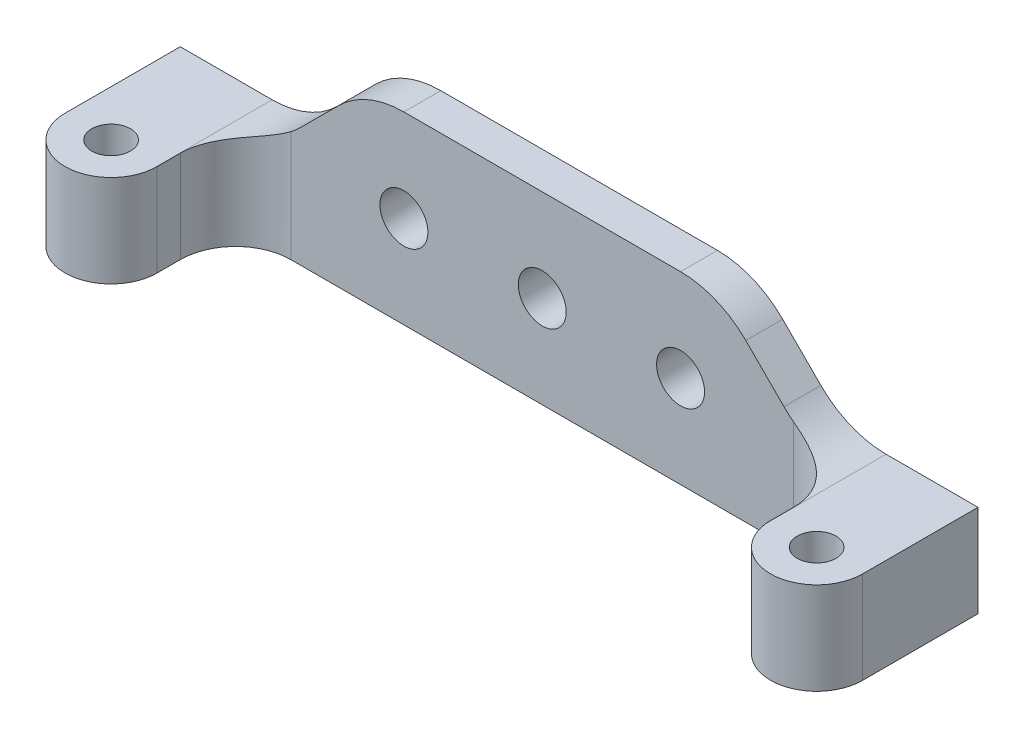
ISO-10303-21;
HEADER;
FILE_DESCRIPTION(('STEP AP214'),'2;1');
FILE_NAME('part.step','',(''),(''),'','','');
FILE_SCHEMA(('AUTOMOTIVE_DESIGN { 1 0 10303 214 1 1 1 1 }'));
ENDSEC;
DATA;
#1=APPLICATION_CONTEXT('core data for automotive mechanical design processes');
#2=APPLICATION_PROTOCOL_DEFINITION('international standard','automotive_design',2000,#1);
#3=PRODUCT_CONTEXT('',#1,'mechanical');
#4=PRODUCT('Part','Part','',(#3));
#5=PRODUCT_RELATED_PRODUCT_CATEGORY('part','',(#4));
#6=PRODUCT_DEFINITION_FORMATION('','',#4);
#7=PRODUCT_DEFINITION_CONTEXT('part definition',#1,'design');
#8=PRODUCT_DEFINITION('design','',#6,#7);
#9=PRODUCT_DEFINITION_SHAPE('','',#8);
#10=(LENGTH_UNIT() NAMED_UNIT(*) SI_UNIT(.MILLI.,.METRE.));
#11=(NAMED_UNIT(*) PLANE_ANGLE_UNIT() SI_UNIT($,.RADIAN.));
#12=(NAMED_UNIT(*) SI_UNIT($,.STERADIAN.) SOLID_ANGLE_UNIT());
#13=UNCERTAINTY_MEASURE_WITH_UNIT(LENGTH_MEASURE(1.E-05),#10,'distance_accuracy_value','');
#14=(GEOMETRIC_REPRESENTATION_CONTEXT(3) GLOBAL_UNCERTAINTY_ASSIGNED_CONTEXT((#13)) GLOBAL_UNIT_ASSIGNED_CONTEXT((#10,
#11,#12)) REPRESENTATION_CONTEXT('',''));
#15=CARTESIAN_POINT('',(0.,0.,0.));
#16=DIRECTION('',(0.,0.,1.));
#17=DIRECTION('',(1.,0.,0.));
#18=AXIS2_PLACEMENT_3D('',#15,#16,#17);
#19=CARTESIAN_POINT('',(-50.9999999999999,10.,17.5000000000001));
#20=DIRECTION('',(0.,0.,-1.));
#21=DIRECTION('',(-1.,0.,0.));
#22=AXIS2_PLACEMENT_3D('',#19,#20,#21);
#23=CYLINDRICAL_SURFACE('',#22,2.6);
#24=CARTESIAN_POINT('',(-50.9999999999999,10.,0.));
#25=DIRECTION('',(0.,0.,1.));
#26=DIRECTION('',(1.,0.,0.));
#27=AXIS2_PLACEMENT_3D('',#24,#25,#26);
#28=CIRCLE('',#27,2.6);
#29=CARTESIAN_POINT('',(-48.3999999999999,10.,0.));
#30=VERTEX_POINT('',#29);
#31=EDGE_CURVE('E406',#30,#30,#28,.T.);
#32=ORIENTED_EDGE('',*,*,#31,.F.);
#33=EDGE_LOOP('',(#32));
#34=FACE_BOUND('',#33,.T.);
#35=CARTESIAN_POINT('',(-50.9999999999999,10.,4.00000000000001));
#36=DIRECTION('',(0.,0.,-1.));
#37=DIRECTION('',(-1.,0.,0.));
#38=AXIS2_PLACEMENT_3D('',#35,#36,#37);
#39=CIRCLE('',#38,2.6);
#40=CARTESIAN_POINT('',(-53.5999999999999,10.,4.00000000000001));
#41=VERTEX_POINT('',#40);
#42=EDGE_CURVE('E384',#41,#41,#39,.F.);
#43=ORIENTED_EDGE('',*,*,#42,.T.);
#44=EDGE_LOOP('',(#43));
#45=FACE_BOUND('',#44,.T.);
#46=ADVANCED_FACE('F43',(#34,#45),#23,.F.);
#47=CARTESIAN_POINT('',(-35.9999999999999,10.,17.5000000000001));
#48=DIRECTION('',(0.,0.,-1.));
#49=DIRECTION('',(-1.,0.,0.));
#50=AXIS2_PLACEMENT_3D('',#47,#48,#49);
#51=CYLINDRICAL_SURFACE('',#50,2.6);
#52=CARTESIAN_POINT('',(-35.9999999999999,10.,0.));
#53=DIRECTION('',(0.,0.,1.));
#54=DIRECTION('',(1.,0.,0.));
#55=AXIS2_PLACEMENT_3D('',#52,#53,#54);
#56=CIRCLE('',#55,2.6);
#57=CARTESIAN_POINT('',(-33.3999999999999,10.,0.));
#58=VERTEX_POINT('',#57);
#59=EDGE_CURVE('E389',#58,#58,#56,.T.);
#60=ORIENTED_EDGE('',*,*,#59,.F.);
#61=EDGE_LOOP('',(#60));
#62=FACE_BOUND('',#61,.T.);
#63=CARTESIAN_POINT('',(-35.9999999999999,10.,4.00000000000001));
#64=DIRECTION('',(0.,0.,-1.));
#65=DIRECTION('',(-1.,0.,0.));
#66=AXIS2_PLACEMENT_3D('',#63,#64,#65);
#67=CIRCLE('',#66,2.6);
#68=CARTESIAN_POINT('',(-38.5999999999999,10.,4.00000000000001));
#69=VERTEX_POINT('',#68);
#70=EDGE_CURVE('E47',#69,#69,#67,.F.);
#71=ORIENTED_EDGE('',*,*,#70,.T.);
#72=EDGE_LOOP('',(#71));
#73=FACE_BOUND('',#72,.T.);
#74=ADVANCED_FACE('F282',(#62,#73),#51,.F.);
#75=CARTESIAN_POINT('',(0.,10.,17.5000000000001));
#76=DIRECTION('',(0.,-1.,0.));
#77=DIRECTION('',(0.,0.,-1.));
#78=AXIS2_PLACEMENT_3D('',#75,#76,#77);
#79=PLANE('',#78);
#80=CARTESIAN_POINT('',(-12.7500000000001,10.,12.5000000000001));
#81=DIRECTION('',(0.,-1.,0.));
#82=DIRECTION('',(0.,0.,-1.));
#83=AXIS2_PLACEMENT_3D('',#80,#81,#82);
#84=CIRCLE('',#83,5.);
#85=CARTESIAN_POINT('',(-7.74999999999993,10.,12.5000000000001));
#86=VERTEX_POINT('',#85);
#87=CARTESIAN_POINT('',(-17.715728752538,10.,13.0844124880761));
#88=VERTEX_POINT('',#87);
#89=EDGE_CURVE('E295',#86,#88,#84,.T.);
#90=ORIENTED_EDGE('',*,*,#89,.F.);
#91=DIRECTION('',(0.,0.,-1.));
#92=VECTOR('',#91,1.);
#93=CARTESIAN_POINT('',(-7.74999999999993,10.,17.5000000000001));
#94=LINE('',#93,#92);
#95=CARTESIAN_POINT('',(-7.74999999999993,10.,0.));
#96=VERTEX_POINT('',#95);
#97=EDGE_CURVE('E356',#86,#96,#94,.T.);
#98=ORIENTED_EDGE('',*,*,#97,.T.);
#99=DIRECTION('',(-1.,0.,0.));
#100=VECTOR('',#99,1.);
#101=CARTESIAN_POINT('',(0.,10.,0.));
#102=LINE('',#101,#100);
#103=CARTESIAN_POINT('',(-17.715728752538,10.,0.));
#104=VERTEX_POINT('',#103);
#105=EDGE_CURVE('E363',#96,#104,#102,.T.);
#106=ORIENTED_EDGE('',*,*,#105,.T.);
#107=DIRECTION('',(0.,0.,-1.));
#108=VECTOR('',#107,1.);
#109=CARTESIAN_POINT('',(-17.715728752538,10.,17.5000000000001));
#110=LINE('',#109,#108);
#111=EDGE_CURVE('E424',#88,#104,#110,.T.);
#112=ORIENTED_EDGE('',*,*,#111,.F.);
#113=EDGE_LOOP('',(#90,#98,#106,#112));
#114=FACE_BOUND('',#113,.T.);
#115=CARTESIAN_POINT('',(-12.7500000000001,10.,12.5000000000001));
#116=DIRECTION('',(0.,-1.,0.));
#117=DIRECTION('',(0.,0.,-1.));
#118=AXIS2_PLACEMENT_3D('',#115,#116,#117);
#119=CIRCLE('',#118,2.10000000000022);
#120=CARTESIAN_POINT('',(-12.7500000000001,10.,10.3999999999999));
#121=VERTEX_POINT('',#120);
#122=EDGE_CURVE('E250',#121,#121,#119,.T.);
#123=ORIENTED_EDGE('',*,*,#122,.T.);
#124=EDGE_LOOP('',(#123));
#125=FACE_BOUND('',#124,.T.);
#126=ADVANCED_FACE('F278',(#114,#125),#79,.F.);
#127=CARTESIAN_POINT('',(-17.715728752538,20.,17.5000000000001));
#128=DIRECTION('',(0.,0.,-1.));
#129=DIRECTION('',(-1.,0.,0.));
#130=AXIS2_PLACEMENT_3D('',#127,#128,#129);
#131=CYLINDRICAL_SURFACE('',#130,10.);
#132=CARTESIAN_POINT('',(-17.715728752538,10.,13.0844124880761));
#133=CARTESIAN_POINT('',(-17.72714759944,10.0000122219756,12.98734507658));
#134=CARTESIAN_POINT('',(-17.7357129601795,10.0000232268045,12.8901103301895));
#135=CARTESIAN_POINT('',(-17.7471367093408,10.0000428021687,12.6953061674979));
#136=CARTESIAN_POINT('',(-17.7499950977553,10.000051372704,12.5977367511963));
#137=CARTESIAN_POINT('',(-17.7500000000002,10.0000587260926,12.5000000000001));
#138=B_SPLINE_CURVE_WITH_KNOTS('',3,(#132,#133,#134,#135,#136,#137),.UNSPECIFIED.,.F.,.F.,(4,2,
4),(0.,0.292833831518646,0.585667663404383),.UNSPECIFIED.);
#139=CARTESIAN_POINT('',(-17.7499999999999,10.0000587260926,12.5000000000001));
#140=VERTEX_POINT('',#139);
#141=EDGE_CURVE('E285',#88,#140,#138,.T.);
#142=ORIENTED_EDGE('',*,*,#141,.F.);
#143=ORIENTED_EDGE('',*,*,#111,.T.);
#144=CARTESIAN_POINT('',(-17.715728752538,20.,0.));
#145=DIRECTION('',(0.,0.,1.));
#146=DIRECTION('',(1.,0.,0.));
#147=AXIS2_PLACEMENT_3D('',#144,#145,#146);
#148=CIRCLE('',#147,10.);
#149=CARTESIAN_POINT('',(-24.7867965644034,12.9289321881345,0.));
#150=VERTEX_POINT('',#149);
#151=EDGE_CURVE('E381',#104,#150,#148,.F.);
#152=ORIENTED_EDGE('',*,*,#151,.T.);
#153=DIRECTION('',(0.,0.,-1.));
#154=VECTOR('',#153,1.);
#155=CARTESIAN_POINT('',(-24.7867965644034,12.9289321881345,17.5000000000001));
#156=LINE('',#155,#154);
#157=CARTESIAN_POINT('',(-24.7867965644034,12.9289321881345,4.));
#158=VERTEX_POINT('',#157);
#159=EDGE_CURVE('E52',#158,#150,#156,.T.);
#160=ORIENTED_EDGE('',*,*,#159,.F.);
#161=CARTESIAN_POINT('',(-17.715728752538,20.,4.));
#162=DIRECTION('',(0.,0.,-1.));
#163=DIRECTION('',(-1.,0.,0.));
#164=AXIS2_PLACEMENT_3D('',#161,#162,#163);
#165=CIRCLE('',#164,10.);
#166=CARTESIAN_POINT('',(-23.7499999999999,12.0258185051973,4.));
#167=VERTEX_POINT('',#166);
#168=EDGE_CURVE('E245',#167,#158,#165,.T.);
#169=ORIENTED_EDGE('',*,*,#168,.F.);
#170=CARTESIAN_POINT('',(-23.7499999999999,12.0258185051973,4.));
#171=CARTESIAN_POINT('',(-23.6172230581114,11.92530824979,3.99998646530528));
#172=CARTESIAN_POINT('',(-23.481858145601,11.8281240874138,4.00440806677916));
#173=CARTESIAN_POINT('',(-23.206815270327,11.6408417731282,4.02305046853741));
#174=CARTESIAN_POINT('',(-23.0671339219318,11.5507493908154,4.03727915752995));
#175=CARTESIAN_POINT('',(-22.7841779795801,11.3780281956086,4.07651759240204));
#176=CARTESIAN_POINT('',(-22.6408951358117,11.2954189877547,4.10155472003588));
#177=CARTESIAN_POINT('',(-22.3523846984196,11.1383761359853,4.16318413999597));
#178=CARTESIAN_POINT('',(-22.207157653609,11.063940237298,4.19977323463076));
#179=CARTESIAN_POINT('',(-21.9153865061705,10.9231473519918,4.28533238167121));
#180=CARTESIAN_POINT('',(-21.7688395201546,10.8568359435723,4.33436792943259));
#181=CARTESIAN_POINT('',(-21.4768279258171,10.732891842249,4.44508598227433));
#182=CARTESIAN_POINT('',(-21.3313634179188,10.6752599452464,4.50676964594914));
#183=CARTESIAN_POINT('',(-21.0435679339575,10.5687231259943,4.64271555176517));
#184=CARTESIAN_POINT('',(-20.9012308266656,10.5197994818704,4.71695012347833));
#185=CARTESIAN_POINT('',(-20.6210871136743,10.4302288866549,4.87789167518328));
#186=CARTESIAN_POINT('',(-20.483280122827,10.3895812304096,4.96459759148193));
#187=CARTESIAN_POINT('',(-20.2249006727214,10.3190652446057,5.14240636218474));
#188=CARTESIAN_POINT('',(-20.1038422023031,10.2885858622608,5.23256355875477));
#189=CARTESIAN_POINT('',(-19.8680326450113,10.2336162549194,5.42252704162606));
#190=CARTESIAN_POINT('',(-19.7532837822739,10.2091281314811,5.52233669664732));
#191=CARTESIAN_POINT('',(-19.5311485129902,10.1655161960305,5.73098122989024));
#192=CARTESIAN_POINT('',(-19.4237645387354,10.1463941498077,5.83981906374329));
#193=CARTESIAN_POINT('',(-19.217260689315,10.1128187575031,6.06582697833074));
#194=CARTESIAN_POINT('',(-19.1181446027684,10.0983675431257,6.18300083383213));
#195=CARTESIAN_POINT('',(-18.9277393051718,10.0732493581614,6.42648543764984));
#196=CARTESIAN_POINT('',(-18.8365728436858,10.0626357200095,6.55289762185442));
#197=CARTESIAN_POINT('',(-18.6642588809624,10.0447100995114,6.81259909595371));
#198=CARTESIAN_POINT('',(-18.5831118099201,10.0373982588963,6.94588868079007));
#199=CARTESIAN_POINT('',(-18.4313778680721,10.025349945967,7.218524520071));
#200=CARTESIAN_POINT('',(-18.3607950261754,10.0206144543973,7.35787305922247));
#201=CARTESIAN_POINT('',(-18.2307136212895,10.0130568558053,7.64164532283018));
#202=CARTESIAN_POINT('',(-18.1712119011291,10.010234203181,7.78606758772689));
#203=CARTESIAN_POINT('',(-18.0568678004271,10.0056360423449,8.09759939782555));
#204=CARTESIAN_POINT('',(-18.003555908073,10.0040371759943,8.26527555541809));
#205=CARTESIAN_POINT('',(-17.9118494109621,10.0018188181985,8.60468193996743));
#206=CARTESIAN_POINT('',(-17.8734567863854,10.0011994567258,8.77641270187065));
#207=CARTESIAN_POINT('',(-17.8118662100944,10.0004117971798,9.12277619380291));
#208=CARTESIAN_POINT('',(-17.7886851582339,10.000244000149,9.29741193119384));
#209=CARTESIAN_POINT('',(-17.7577417549573,10.0000864509712,9.6480310772821));
#210=CARTESIAN_POINT('',(-17.749978296703,10.0000966860425,9.8240143883257));
#211=CARTESIAN_POINT('',(-17.7499999999999,10.0000587260926,10.));
#212=B_SPLINE_CURVE_WITH_KNOTS('',3,(#170,#171,#172,#173,#174,#175,#176,#177,#178,#179,#180,
#181,#182,#183,#184,#185,#186,#187,#188,#189,#190,#191,#192,#193,#194,#195,#196,#197,#198,#199,
#200,#201,#202,#203,#204,#205,#206,#207,#208,#209,#210,#211),.UNSPECIFIED.,.F.,.F.,(4,2,2,2,2,2,
2,2,2,2,2,2,2,2,2,2,2,2,2,2,4),(0.,0.499560454354816,0.999523219068908,1.50076007558072,
2.00185830655493,2.50565014072847,3.00948814394277,3.5122295065983,4.01492801535128,
4.47634861589501,4.93793083797473,5.39966477308059,5.86160914073404,6.32974674191946,
6.79790443619431,7.26624022059105,7.73444236455432,8.26160848282372,8.78884454605476,
9.31666537423279,9.84444830847116),.UNSPECIFIED.);
#213=CARTESIAN_POINT('',(-17.7499999999999,10.0000587260926,10.));
#214=VERTEX_POINT('',#213);
#215=EDGE_CURVE('E408',#167,#214,#212,.T.);
#216=ORIENTED_EDGE('',*,*,#215,.T.);
#217=DIRECTION('',(0.,0.,-1.));
#218=VECTOR('',#217,1.);
#219=CARTESIAN_POINT('',(-17.7499999999999,10.0000587260926,17.5000000000001));
#220=LINE('',#219,#218);
#221=EDGE_CURVE('E294',#214,#140,#220,.F.);
#222=ORIENTED_EDGE('',*,*,#221,.T.);
#223=EDGE_LOOP('',(#142,#143,#152,#160,#169,#216,#222));
#224=FACE_BOUND('',#223,.T.);
#225=ADVANCED_FACE('F272',(#224),#131,.F.);
#226=CARTESIAN_POINT('',(-35.9999999999999,10.,17.5000000000001));
#227=DIRECTION('',(0.,0.,-1.));
#228=DIRECTION('',(-1.,0.,0.));
#229=AXIS2_PLACEMENT_3D('',#226,#227,#228);
#230=CYLINDRICAL_SURFACE('',#229,10.);
#231=DIRECTION('',(0.,0.,-1.));
#232=VECTOR('',#231,1.);
#233=CARTESIAN_POINT('',(-35.9999999999999,20.,17.5000000000001));
#234=LINE('',#233,#232);
#235=CARTESIAN_POINT('',(-35.9999999999999,20.,4.));
#236=VERTEX_POINT('',#235);
#237=CARTESIAN_POINT('',(-35.9999999999999,20.,0.));
#238=VERTEX_POINT('',#237);
#239=EDGE_CURVE('E415',#236,#238,#234,.T.);
#240=ORIENTED_EDGE('',*,*,#239,.F.);
#241=CARTESIAN_POINT('',(-35.9999999999999,10.,4.00000000000001));
#242=DIRECTION('',(0.,0.,-1.));
#243=DIRECTION('',(-1.,0.,0.));
#244=AXIS2_PLACEMENT_3D('',#241,#242,#243);
#245=CIRCLE('',#244,10.);
#246=CARTESIAN_POINT('',(-28.9289321881345,17.0710678118655,4.00000000000001));
#247=VERTEX_POINT('',#246);
#248=EDGE_CURVE('E251',#236,#247,#245,.T.);
#249=ORIENTED_EDGE('',*,*,#248,.T.);
#250=DIRECTION('',(0.,0.,-1.));
#251=VECTOR('',#250,1.);
#252=CARTESIAN_POINT('',(-28.9289321881345,17.0710678118655,17.5000000000001));
#253=LINE('',#252,#251);
#254=CARTESIAN_POINT('',(-28.9289321881345,17.0710678118655,0.));
#255=VERTEX_POINT('',#254);
#256=EDGE_CURVE('E11',#247,#255,#253,.T.);
#257=ORIENTED_EDGE('',*,*,#256,.T.);
#258=CARTESIAN_POINT('',(-35.9999999999999,10.,0.));
#259=DIRECTION('',(0.,0.,1.));
#260=DIRECTION('',(1.,0.,0.));
#261=AXIS2_PLACEMENT_3D('',#258,#259,#260);
#262=CIRCLE('',#261,10.);
#263=EDGE_CURVE('E390',#238,#255,#262,.F.);
#264=ORIENTED_EDGE('',*,*,#263,.F.);
#265=EDGE_LOOP('',(#240,#249,#257,#264));
#266=FACE_BOUND('',#265,.T.);
#267=ADVANCED_FACE('F277',(#266),#230,.T.);
#268=CARTESIAN_POINT('',(-5.92893218813432,-5.92893218813439,17.5000000000001));
#269=DIRECTION('',(0.707106781186543,0.707106781186552,0.));
#270=DIRECTION('',(-0.707106781186552,0.707106781186543,0.));
#271=AXIS2_PLACEMENT_3D('',#268,#269,#270);
#272=PLANE('',#271);
#273=ORIENTED_EDGE('',*,*,#256,.F.);
#274=DIRECTION('',(0.707106781186552,-0.707106781186543,0.));
#275=VECTOR('',#274,1.);
#276=CARTESIAN_POINT('',(-15.9289321881343,4.0710678118655,4.));
#277=LINE('',#276,#275);
#278=EDGE_CURVE('E249',#247,#158,#277,.T.);
#279=ORIENTED_EDGE('',*,*,#278,.T.);
#280=ORIENTED_EDGE('',*,*,#159,.T.);
#281=DIRECTION('',(0.707106781186552,-0.707106781186543,0.));
#282=VECTOR('',#281,1.);
#283=CARTESIAN_POINT('',(-5.92893218813432,-5.92893218813439,0.));
#284=LINE('',#283,#282);
#285=EDGE_CURVE('E386',#255,#150,#284,.T.);
#286=ORIENTED_EDGE('',*,*,#285,.F.);
#287=EDGE_LOOP('',(#273,#279,#280,#286));
#288=FACE_BOUND('',#287,.T.);
#289=ADVANCED_FACE('F303',(#288),#272,.T.);
#290=CARTESIAN_POINT('',(-12.7500000000001,20.,12.5000000000001));
#291=DIRECTION('',(0.,-1.,0.));
#292=DIRECTION('',(0.,0.,-1.));
#293=AXIS2_PLACEMENT_3D('',#290,#291,#292);
#294=CYLINDRICAL_SURFACE('',#293,5.);
#295=DIRECTION('',(0.,-1.,0.));
#296=VECTOR('',#295,1.);
#297=CARTESIAN_POINT('',(-7.74999999999993,20.,12.5000000000001));
#298=LINE('',#297,#296);
#299=CARTESIAN_POINT('',(-7.74999999999993,0.,12.5000000000001));
#300=VERTEX_POINT('',#299);
#301=EDGE_CURVE('E359',#86,#300,#298,.T.);
#302=ORIENTED_EDGE('',*,*,#301,.F.);
#303=ORIENTED_EDGE('',*,*,#89,.T.);
#304=ORIENTED_EDGE('',*,*,#141,.T.);
#305=DIRECTION('',(0.,-1.,0.));
#306=VECTOR('',#305,1.);
#307=CARTESIAN_POINT('',(-17.7499999999999,20.,12.5000000000001));
#308=LINE('',#307,#306);
#309=CARTESIAN_POINT('',(-17.7499999999999,0.,12.5000000000001));
#310=VERTEX_POINT('',#309);
#311=EDGE_CURVE('E370',#140,#310,#308,.T.);
#312=ORIENTED_EDGE('',*,*,#311,.T.);
#313=CARTESIAN_POINT('',(-12.7500000000001,0.,12.5000000000001));
#314=DIRECTION('',(0.,1.,0.));
#315=DIRECTION('',(0.,0.,1.));
#316=AXIS2_PLACEMENT_3D('',#313,#314,#315);
#317=CIRCLE('',#316,5.);
#318=EDGE_CURVE('E368',#310,#300,#317,.T.);
#319=ORIENTED_EDGE('',*,*,#318,.T.);
#320=EDGE_LOOP('',(#302,#303,#304,#312,#319));
#321=FACE_BOUND('',#320,.T.);
#322=ADVANCED_FACE('F298',(#321),#294,.T.);
#323=CARTESIAN_POINT('',(-12.7500000000001,20.,12.5000000000001));
#324=DIRECTION('',(0.,-1.,0.));
#325=DIRECTION('',(0.,0.,-1.));
#326=AXIS2_PLACEMENT_3D('',#323,#324,#325);
#327=CYLINDRICAL_SURFACE('',#326,2.10000000000022);
#328=CARTESIAN_POINT('',(-12.7500000000001,0.,12.5000000000001));
#329=DIRECTION('',(0.,1.,0.));
#330=DIRECTION('',(0.,0.,1.));
#331=AXIS2_PLACEMENT_3D('',#328,#329,#330);
#332=CIRCLE('',#331,2.10000000000022);
#333=CARTESIAN_POINT('',(-12.7500000000001,0.,14.6000000000003));
#334=VERTEX_POINT('',#333);
#335=EDGE_CURVE('E398',#334,#334,#332,.T.);
#336=ORIENTED_EDGE('',*,*,#335,.F.);
#337=EDGE_LOOP('',(#336));
#338=FACE_BOUND('',#337,.T.);
#339=ORIENTED_EDGE('',*,*,#122,.F.);
#340=EDGE_LOOP('',(#339));
#341=FACE_BOUND('',#340,.T.);
#342=ADVANCED_FACE('F302',(#338,#341),#327,.F.);
#343=CARTESIAN_POINT('',(-23.7499999999999,20.,10.));
#344=DIRECTION('',(0.,-1.,0.));
#345=DIRECTION('',(0.,0.,-1.));
#346=AXIS2_PLACEMENT_3D('',#343,#344,#345);
#347=CYLINDRICAL_SURFACE('',#346,6.);
#348=ORIENTED_EDGE('',*,*,#215,.F.);
#349=DIRECTION('',(0.,-1.,0.));
#350=VECTOR('',#349,1.);
#351=CARTESIAN_POINT('',(-23.7499999999999,20.,4.));
#352=LINE('',#351,#350);
#353=CARTESIAN_POINT('',(-23.7499999999999,0.,4.));
#354=VERTEX_POINT('',#353);
#355=EDGE_CURVE('E372',#167,#354,#352,.T.);
#356=ORIENTED_EDGE('',*,*,#355,.T.);
#357=CARTESIAN_POINT('',(-23.7499999999999,0.,10.));
#358=DIRECTION('',(0.,1.,0.));
#359=DIRECTION('',(0.,0.,1.));
#360=AXIS2_PLACEMENT_3D('',#357,#358,#359);
#361=CIRCLE('',#360,6.);
#362=CARTESIAN_POINT('',(-17.7499999999999,0.,10.));
#363=VERTEX_POINT('',#362);
#364=EDGE_CURVE('E60',#363,#354,#361,.T.);
#365=ORIENTED_EDGE('',*,*,#364,.F.);
#366=DIRECTION('',(0.,-1.,0.));
#367=VECTOR('',#366,1.);
#368=CARTESIAN_POINT('',(-17.7499999999999,20.,10.));
#369=LINE('',#368,#367);
#370=EDGE_CURVE('E374',#214,#363,#369,.T.);
#371=ORIENTED_EDGE('',*,*,#370,.F.);
#372=EDGE_LOOP('',(#348,#356,#365,#371));
#373=FACE_BOUND('',#372,.T.);
#374=ADVANCED_FACE('F268',(#373),#347,.F.);
#375=CARTESIAN_POINT('',(0.,20.,4.));
#376=DIRECTION('',(0.,0.,-1.));
#377=DIRECTION('',(-1.,0.,0.));
#378=AXIS2_PLACEMENT_3D('',#375,#376,#377);
#379=PLANE('',#378);
#380=ORIENTED_EDGE('',*,*,#42,.F.);
#381=EDGE_LOOP('',(#380));
#382=FACE_BOUND('',#381,.T.);
#383=DIRECTION('',(1.,0.,0.));
#384=VECTOR('',#383,1.);
#385=CARTESIAN_POINT('',(0.,20.,4.));
#386=LINE('',#385,#384);
#387=CARTESIAN_POINT('',(-65.9999999999999,20.,4.));
#388=VERTEX_POINT('',#387);
#389=EDGE_CURVE('E399',#388,#236,#386,.T.);
#390=ORIENTED_EDGE('',*,*,#389,.F.);
#391=CARTESIAN_POINT('',(-65.9999999999999,10.,4.00000000000001));
#392=DIRECTION('',(0.,0.,1.));
#393=DIRECTION('',(1.,0.,0.));
#394=AXIS2_PLACEMENT_3D('',#391,#392,#393);
#395=CIRCLE('',#394,10.);
#396=CARTESIAN_POINT('',(-73.0710678118653,17.0710678118655,4.00000000000001));
#397=VERTEX_POINT('',#396);
#398=EDGE_CURVE('E211',#388,#397,#395,.T.);
#399=ORIENTED_EDGE('',*,*,#398,.T.);
#400=DIRECTION('',(-0.707106781186552,-0.707106781186543,0.));
#401=VECTOR('',#400,1.);
#402=CARTESIAN_POINT('',(-86.0710678118655,4.0710678118655,4.));
#403=LINE('',#402,#401);
#404=CARTESIAN_POINT('',(-77.2132034355964,12.9289321881345,4.));
#405=VERTEX_POINT('',#404);
#406=EDGE_CURVE('E244',#397,#405,#403,.T.);
#407=ORIENTED_EDGE('',*,*,#406,.T.);
#408=CARTESIAN_POINT('',(-84.2842712474619,20.,4.));
#409=DIRECTION('',(0.,0.,1.));
#410=DIRECTION('',(1.,0.,0.));
#411=AXIS2_PLACEMENT_3D('',#408,#409,#410);
#412=CIRCLE('',#411,10.);
#413=CARTESIAN_POINT('',(-78.2499999999999,12.0258185051973,4.));
#414=VERTEX_POINT('',#413);
#415=EDGE_CURVE('E206',#414,#405,#412,.T.);
#416=ORIENTED_EDGE('',*,*,#415,.F.);
#417=DIRECTION('',(0.,-1.,0.));
#418=VECTOR('',#417,1.);
#419=CARTESIAN_POINT('',(-78.2499999999999,20.,4.));
#420=LINE('',#419,#418);
#421=CARTESIAN_POINT('',(-78.2499999999999,0.,4.));
#422=VERTEX_POINT('',#421);
#423=EDGE_CURVE('E199',#414,#422,#420,.T.);
#424=ORIENTED_EDGE('',*,*,#423,.T.);
#425=DIRECTION('',(1.,0.,0.));
#426=VECTOR('',#425,1.);
#427=CARTESIAN_POINT('',(0.,0.,4.));
#428=LINE('',#427,#426);
#429=EDGE_CURVE('E380',#422,#354,#428,.T.);
#430=ORIENTED_EDGE('',*,*,#429,.T.);
#431=ORIENTED_EDGE('',*,*,#355,.F.);
#432=ORIENTED_EDGE('',*,*,#168,.T.);
#433=ORIENTED_EDGE('',*,*,#278,.F.);
#434=ORIENTED_EDGE('',*,*,#248,.F.);
#435=EDGE_LOOP('',(#390,#399,#407,#416,#424,#430,#431,#432,#433,#434));
#436=FACE_BOUND('',#435,.T.);
#437=ORIENTED_EDGE('',*,*,#70,.F.);
#438=EDGE_LOOP('',(#437));
#439=FACE_BOUND('',#438,.T.);
#440=CARTESIAN_POINT('',(-65.9999999999999,10.,4.00000000000001));
#441=DIRECTION('',(0.,0.,1.));
#442=DIRECTION('',(1.,0.,0.));
#443=AXIS2_PLACEMENT_3D('',#440,#441,#442);
#444=CIRCLE('',#443,2.6);
#445=CARTESIAN_POINT('',(-63.3999999999999,10.,4.00000000000001));
#446=VERTEX_POINT('',#445);
#447=EDGE_CURVE('E241',#446,#446,#444,.F.);
#448=ORIENTED_EDGE('',*,*,#447,.T.);
#449=EDGE_LOOP('',(#448));
#450=FACE_BOUND('',#449,.T.);
#451=ADVANCED_FACE('F45',(#382,#436,#439,#450),#379,.F.);
#452=CARTESIAN_POINT('',(-17.7499999999999,20.,0.));
#453=DIRECTION('',(-1.,0.,0.));
#454=DIRECTION('',(0.,0.,1.));
#455=AXIS2_PLACEMENT_3D('',#452,#453,#454);
#456=PLANE('',#455);
#457=ORIENTED_EDGE('',*,*,#221,.F.);
#458=ORIENTED_EDGE('',*,*,#370,.T.);
#459=DIRECTION('',(0.,0.,-1.));
#460=VECTOR('',#459,1.);
#461=CARTESIAN_POINT('',(-17.7499999999999,0.,0.));
#462=LINE('',#461,#460);
#463=EDGE_CURVE('E67',#310,#363,#462,.T.);
#464=ORIENTED_EDGE('',*,*,#463,.F.);
#465=ORIENTED_EDGE('',*,*,#311,.F.);
#466=EDGE_LOOP('',(#457,#458,#464,#465));
#467=FACE_BOUND('',#466,.T.);
#468=ADVANCED_FACE('F280',(#467),#456,.T.);
#469=CARTESIAN_POINT('',(0.,0.,0.));
#470=DIRECTION('',(0.,1.,0.));
#471=DIRECTION('',(0.,0.,1.));
#472=AXIS2_PLACEMENT_3D('',#469,#470,#471);
#473=PLANE('',#472);
#474=ORIENTED_EDGE('',*,*,#364,.T.);
#475=ORIENTED_EDGE('',*,*,#429,.F.);
#476=CARTESIAN_POINT('',(-78.2499999999999,0.,10.));
#477=DIRECTION('',(0.,-1.,0.));
#478=DIRECTION('',(0.,0.,1.));
#479=AXIS2_PLACEMENT_3D('',#476,#477,#478);
#480=CIRCLE('',#479,6.);
#481=CARTESIAN_POINT('',(-84.2499999999999,0.,10.));
#482=VERTEX_POINT('',#481);
#483=EDGE_CURVE('E664',#482,#422,#480,.T.);
#484=ORIENTED_EDGE('',*,*,#483,.F.);
#485=DIRECTION('',(0.,0.,-1.));
#486=VECTOR('',#485,1.);
#487=CARTESIAN_POINT('',(-84.2499999999999,0.,0.));
#488=LINE('',#487,#486);
#489=CARTESIAN_POINT('',(-84.2499999999999,0.,12.5000000000001));
#490=VERTEX_POINT('',#489);
#491=EDGE_CURVE('E181',#490,#482,#488,.T.);
#492=ORIENTED_EDGE('',*,*,#491,.F.);
#493=CARTESIAN_POINT('',(-89.2499999999997,0.,12.5000000000001));
#494=DIRECTION('',(0.,-1.,0.));
#495=DIRECTION('',(0.,0.,1.));
#496=AXIS2_PLACEMENT_3D('',#493,#494,#495);
#497=CIRCLE('',#496,5.);
#498=CARTESIAN_POINT('',(-94.2499999999999,0.,12.5000000000001));
#499=VERTEX_POINT('',#498);
#500=EDGE_CURVE('E185',#490,#499,#497,.T.);
#501=ORIENTED_EDGE('',*,*,#500,.T.);
#502=DIRECTION('',(0.,0.,-1.));
#503=VECTOR('',#502,1.);
#504=CARTESIAN_POINT('',(-94.2499999999999,0.,0.));
#505=LINE('',#504,#503);
#506=CARTESIAN_POINT('',(-94.2499999999999,0.,0.));
#507=VERTEX_POINT('',#506);
#508=EDGE_CURVE('E171',#499,#507,#505,.T.);
#509=ORIENTED_EDGE('',*,*,#508,.T.);
#510=DIRECTION('',(-1.,0.,0.));
#511=VECTOR('',#510,1.);
#512=CARTESIAN_POINT('',(0.,0.,0.));
#513=LINE('',#512,#511);
#514=CARTESIAN_POINT('',(-7.74999999999993,0.,0.));
#515=VERTEX_POINT('',#514);
#516=EDGE_CURVE('E403',#515,#507,#513,.T.);
#517=ORIENTED_EDGE('',*,*,#516,.F.);
#518=DIRECTION('',(0.,0.,-1.));
#519=VECTOR('',#518,1.);
#520=CARTESIAN_POINT('',(-7.74999999999993,0.,0.));
#521=LINE('',#520,#519);
#522=EDGE_CURVE('E405',#300,#515,#521,.T.);
#523=ORIENTED_EDGE('',*,*,#522,.F.);
#524=ORIENTED_EDGE('',*,*,#318,.F.);
#525=ORIENTED_EDGE('',*,*,#463,.T.);
#526=EDGE_LOOP('',(#474,#475,#484,#492,#501,#509,#517,#523,#524,#525));
#527=FACE_BOUND('',#526,.T.);
#528=ORIENTED_EDGE('',*,*,#335,.T.);
#529=EDGE_LOOP('',(#528));
#530=FACE_BOUND('',#529,.T.);
#531=CARTESIAN_POINT('',(-89.2499999999997,0.,12.5000000000001));
#532=DIRECTION('',(0.,-1.,0.));
#533=DIRECTION('',(0.,0.,1.));
#534=AXIS2_PLACEMENT_3D('',#531,#532,#533);
#535=CIRCLE('',#534,2.10000000000022);
#536=CARTESIAN_POINT('',(-89.2499999999997,0.,14.6000000000003));
#537=VERTEX_POINT('',#536);
#538=EDGE_CURVE('E182',#537,#537,#535,.T.);
#539=ORIENTED_EDGE('',*,*,#538,.F.);
#540=EDGE_LOOP('',(#539));
#541=FACE_BOUND('',#540,.T.);
#542=ADVANCED_FACE('F186',(#527,#530,#541),#473,.F.);
#543=CARTESIAN_POINT('',(0.,20.,0.));
#544=DIRECTION('',(0.,1.,0.));
#545=DIRECTION('',(0.,0.,1.));
#546=AXIS2_PLACEMENT_3D('',#543,#544,#545);
#547=PLANE('',#546);
#548=ORIENTED_EDGE('',*,*,#389,.T.);
#549=ORIENTED_EDGE('',*,*,#239,.T.);
#550=DIRECTION('',(-1.,0.,0.));
#551=VECTOR('',#550,1.);
#552=CARTESIAN_POINT('',(0.,20.,0.));
#553=LINE('',#552,#551);
#554=CARTESIAN_POINT('',(-65.9999999999999,20.,0.));
#555=VERTEX_POINT('',#554);
#556=EDGE_CURVE('E395',#238,#555,#553,.T.);
#557=ORIENTED_EDGE('',*,*,#556,.T.);
#558=DIRECTION('',(0.,0.,-1.));
#559=VECTOR('',#558,1.);
#560=CARTESIAN_POINT('',(-65.9999999999999,20.,17.5000000000001));
#561=LINE('',#560,#559);
#562=EDGE_CURVE('E233',#388,#555,#561,.T.);
#563=ORIENTED_EDGE('',*,*,#562,.F.);
#564=EDGE_LOOP('',(#548,#549,#557,#563));
#565=FACE_BOUND('',#564,.T.);
#566=ADVANCED_FACE('F314',(#565),#547,.T.);
#567=CARTESIAN_POINT('',(0.,20.,0.));
#568=DIRECTION('',(0.,0.,1.));
#569=DIRECTION('',(1.,0.,0.));
#570=AXIS2_PLACEMENT_3D('',#567,#568,#569);
#571=PLANE('',#570);
#572=ORIENTED_EDGE('',*,*,#31,.T.);
#573=EDGE_LOOP('',(#572));
#574=FACE_BOUND('',#573,.T.);
#575=ORIENTED_EDGE('',*,*,#59,.T.);
#576=EDGE_LOOP('',(#575));
#577=FACE_BOUND('',#576,.T.);
#578=ORIENTED_EDGE('',*,*,#516,.T.);
#579=DIRECTION('',(0.,-1.,0.));
#580=VECTOR('',#579,1.);
#581=CARTESIAN_POINT('',(-94.2499999999999,20.,0.));
#582=LINE('',#581,#580);
#583=CARTESIAN_POINT('',(-94.2499999999999,10.,0.));
#584=VERTEX_POINT('',#583);
#585=EDGE_CURVE('E178',#584,#507,#582,.T.);
#586=ORIENTED_EDGE('',*,*,#585,.F.);
#587=DIRECTION('',(1.,0.,0.));
#588=VECTOR('',#587,1.);
#589=CARTESIAN_POINT('',(-102.,10.,0.));
#590=LINE('',#589,#588);
#591=CARTESIAN_POINT('',(-84.2842712474619,10.,0.));
#592=VERTEX_POINT('',#591);
#593=EDGE_CURVE('E210',#584,#592,#590,.T.);
#594=ORIENTED_EDGE('',*,*,#593,.T.);
#595=CARTESIAN_POINT('',(-84.2842712474619,20.,0.));
#596=DIRECTION('',(0.,0.,-1.));
#597=DIRECTION('',(-1.,0.,0.));
#598=AXIS2_PLACEMENT_3D('',#595,#596,#597);
#599=CIRCLE('',#598,10.);
#600=CARTESIAN_POINT('',(-77.2132034355964,12.9289321881345,0.));
#601=VERTEX_POINT('',#600);
#602=EDGE_CURVE('E207',#592,#601,#599,.F.);
#603=ORIENTED_EDGE('',*,*,#602,.T.);
#604=DIRECTION('',(-0.707106781186552,-0.707106781186543,0.));
#605=VECTOR('',#604,1.);
#606=CARTESIAN_POINT('',(-96.0710678118655,-5.92893218813439,0.));
#607=LINE('',#606,#605);
#608=CARTESIAN_POINT('',(-73.0710678118653,17.0710678118655,0.));
#609=VERTEX_POINT('',#608);
#610=EDGE_CURVE('E216',#609,#601,#607,.T.);
#611=ORIENTED_EDGE('',*,*,#610,.F.);
#612=CARTESIAN_POINT('',(-65.9999999999999,10.,0.));
#613=DIRECTION('',(0.,0.,-1.));
#614=DIRECTION('',(-1.,0.,0.));
#615=AXIS2_PLACEMENT_3D('',#612,#613,#614);
#616=CIRCLE('',#615,10.);
#617=EDGE_CURVE('E219',#555,#609,#616,.F.);
#618=ORIENTED_EDGE('',*,*,#617,.F.);
#619=ORIENTED_EDGE('',*,*,#556,.F.);
#620=ORIENTED_EDGE('',*,*,#263,.T.);
#621=ORIENTED_EDGE('',*,*,#285,.T.);
#622=ORIENTED_EDGE('',*,*,#151,.F.);
#623=ORIENTED_EDGE('',*,*,#105,.F.);
#624=DIRECTION('',(0.,-1.,0.));
#625=VECTOR('',#624,1.);
#626=CARTESIAN_POINT('',(-7.74999999999993,20.,0.));
#627=LINE('',#626,#625);
#628=EDGE_CURVE('E360',#96,#515,#627,.T.);
#629=ORIENTED_EDGE('',*,*,#628,.T.);
#630=EDGE_LOOP('',(#578,#586,#594,#603,#611,#618,#619,#620,#621,#622,#623,#629));
#631=FACE_BOUND('',#630,.T.);
#632=CARTESIAN_POINT('',(-65.9999999999999,10.,0.));
#633=DIRECTION('',(0.,0.,-1.));
#634=DIRECTION('',(-1.,0.,0.));
#635=AXIS2_PLACEMENT_3D('',#632,#633,#634);
#636=CIRCLE('',#635,2.6);
#637=CARTESIAN_POINT('',(-68.5999999999999,10.,0.));
#638=VERTEX_POINT('',#637);
#639=EDGE_CURVE('E218',#638,#638,#636,.T.);
#640=ORIENTED_EDGE('',*,*,#639,.F.);
#641=EDGE_LOOP('',(#640));
#642=FACE_BOUND('',#641,.T.);
#643=ADVANCED_FACE('F305',(#574,#577,#631,#642),#571,.F.);
#644=CARTESIAN_POINT('',(-7.74999999999993,20.,0.));
#645=DIRECTION('',(-1.,0.,0.));
#646=DIRECTION('',(0.,0.,1.));
#647=AXIS2_PLACEMENT_3D('',#644,#645,#646);
#648=PLANE('',#647);
#649=ORIENTED_EDGE('',*,*,#97,.F.);
#650=ORIENTED_EDGE('',*,*,#301,.T.);
#651=ORIENTED_EDGE('',*,*,#522,.T.);
#652=ORIENTED_EDGE('',*,*,#628,.F.);
#653=EDGE_LOOP('',(#649,#650,#651,#652));
#654=FACE_BOUND('',#653,.T.);
#655=ADVANCED_FACE('F316',(#654),#648,.F.);
#656=CARTESIAN_POINT('',(-65.9999999999999,10.,17.5000000000001));
#657=DIRECTION('',(0.,0.,-1.));
#658=DIRECTION('',(1.,0.,0.));
#659=AXIS2_PLACEMENT_3D('',#656,#657,#658);
#660=CYLINDRICAL_SURFACE('',#659,2.6);
#661=ORIENTED_EDGE('',*,*,#639,.T.);
#662=EDGE_LOOP('',(#661));
#663=FACE_BOUND('',#662,.T.);
#664=ORIENTED_EDGE('',*,*,#447,.F.);
#665=EDGE_LOOP('',(#664));
#666=FACE_BOUND('',#665,.T.);
#667=ADVANCED_FACE('F319',(#663,#666),#660,.F.);
#668=CARTESIAN_POINT('',(-102.,10.,17.5000000000001));
#669=DIRECTION('',(0.,-1.,0.));
#670=DIRECTION('',(0.,0.,-1.));
#671=AXIS2_PLACEMENT_3D('',#668,#669,#670);
#672=PLANE('',#671);
#673=CARTESIAN_POINT('',(-89.2499999999997,10.,12.5000000000001));
#674=DIRECTION('',(0.,1.,0.));
#675=DIRECTION('',(0.,0.,-1.));
#676=AXIS2_PLACEMENT_3D('',#673,#674,#675);
#677=CIRCLE('',#676,5.);
#678=CARTESIAN_POINT('',(-94.2499999999999,10.,12.5000000000001));
#679=VERTEX_POINT('',#678);
#680=CARTESIAN_POINT('',(-84.2842712474619,10.,13.0844124880761));
#681=VERTEX_POINT('',#680);
#682=EDGE_CURVE('E196',#679,#681,#677,.T.);
#683=ORIENTED_EDGE('',*,*,#682,.T.);
#684=DIRECTION('',(0.,0.,-1.));
#685=VECTOR('',#684,1.);
#686=CARTESIAN_POINT('',(-84.2842712474619,10.,17.5000000000001));
#687=LINE('',#686,#685);
#688=EDGE_CURVE('E665',#681,#592,#687,.T.);
#689=ORIENTED_EDGE('',*,*,#688,.T.);
#690=ORIENTED_EDGE('',*,*,#593,.F.);
#691=DIRECTION('',(0.,0.,-1.));
#692=VECTOR('',#691,1.);
#693=CARTESIAN_POINT('',(-94.2499999999999,10.,17.5000000000001));
#694=LINE('',#693,#692);
#695=EDGE_CURVE('E214',#679,#584,#694,.T.);
#696=ORIENTED_EDGE('',*,*,#695,.F.);
#697=EDGE_LOOP('',(#683,#689,#690,#696));
#698=FACE_BOUND('',#697,.T.);
#699=CARTESIAN_POINT('',(-89.2499999999997,10.,12.5000000000001));
#700=DIRECTION('',(0.,1.,0.));
#701=DIRECTION('',(0.,0.,-1.));
#702=AXIS2_PLACEMENT_3D('',#699,#700,#701);
#703=CIRCLE('',#702,2.10000000000022);
#704=CARTESIAN_POINT('',(-89.2499999999997,10.,10.3999999999999));
#705=VERTEX_POINT('',#704);
#706=EDGE_CURVE('E191',#705,#705,#703,.T.);
#707=ORIENTED_EDGE('',*,*,#706,.F.);
#708=EDGE_LOOP('',(#707));
#709=FACE_BOUND('',#708,.T.);
#710=ADVANCED_FACE('F350',(#698,#709),#672,.F.);
#711=CARTESIAN_POINT('',(-84.2842712474619,20.,17.5000000000001));
#712=DIRECTION('',(0.,0.,-1.));
#713=DIRECTION('',(1.,0.,0.));
#714=AXIS2_PLACEMENT_3D('',#711,#712,#713);
#715=CYLINDRICAL_SURFACE('',#714,10.);
#716=CARTESIAN_POINT('',(-84.2842712474619,10.,13.0844124880761));
#717=CARTESIAN_POINT('',(-84.2728524005598,10.0000122219756,12.98734507658));
#718=CARTESIAN_POINT('',(-84.2642870398203,10.0000232268045,12.8901103301895));
#719=CARTESIAN_POINT('',(-84.2528632906591,10.0000428021687,12.6953061674979));
#720=CARTESIAN_POINT('',(-84.2500049022445,10.000051372704,12.5977367511963));
#721=CARTESIAN_POINT('',(-84.2499999999997,10.0000587260926,12.5000000000001));
#722=B_SPLINE_CURVE_WITH_KNOTS('',3,(#716,#717,#718,#719,#720,#721),.UNSPECIFIED.,.F.,.F.,(4,2,
4),(0.,0.292833831518648,0.585667663404383),.UNSPECIFIED.);
#723=CARTESIAN_POINT('',(-84.2499999999999,10.0000587260926,12.5000000000001));
#724=VERTEX_POINT('',#723);
#725=EDGE_CURVE('E632',#681,#724,#722,.T.);
#726=ORIENTED_EDGE('',*,*,#725,.T.);
#727=DIRECTION('',(0.,0.,-1.));
#728=VECTOR('',#727,1.);
#729=CARTESIAN_POINT('',(-84.2499999999999,10.0000587260926,17.5000000000001));
#730=LINE('',#729,#728);
#731=CARTESIAN_POINT('',(-84.2499999999999,10.0000587260926,10.));
#732=VERTEX_POINT('',#731);
#733=EDGE_CURVE('E640',#732,#724,#730,.F.);
#734=ORIENTED_EDGE('',*,*,#733,.F.);
#735=CARTESIAN_POINT('',(-78.2499999999999,12.0258185051973,4.));
#736=CARTESIAN_POINT('',(-78.3827769418885,11.92530824979,3.99998646530528));
#737=CARTESIAN_POINT('',(-78.5181418543988,11.8281240874138,4.00440806677916));
#738=CARTESIAN_POINT('',(-78.7931847296728,11.6408417731282,4.02305046853741));
#739=CARTESIAN_POINT('',(-78.932866078068,11.5507493908155,4.03727915752995));
#740=CARTESIAN_POINT('',(-79.2158220204198,11.3780281956086,4.07651759240204));
#741=CARTESIAN_POINT('',(-79.3591048641881,11.2954189877547,4.10155472003588));
#742=CARTESIAN_POINT('',(-79.6476153015802,11.1383761359853,4.16318413999598));
#743=CARTESIAN_POINT('',(-79.7928423463909,11.063940237298,4.19977323463076));
#744=CARTESIAN_POINT('',(-80.0846134938293,10.9231473519918,4.28533238167121));
#745=CARTESIAN_POINT('',(-80.2311604798453,10.8568359435723,4.33436792943259));
#746=CARTESIAN_POINT('',(-80.5231720741827,10.732891842249,4.44508598227434));
#747=CARTESIAN_POINT('',(-80.668636582081,10.6752599452464,4.50676964594915));
#748=CARTESIAN_POINT('',(-80.9564320660423,10.5687231259943,4.64271555176518));
#749=CARTESIAN_POINT('',(-81.0987691733342,10.5197994818704,4.71695012347834));
#750=CARTESIAN_POINT('',(-81.3789128863256,10.4302288866549,4.87789167518328));
#751=CARTESIAN_POINT('',(-81.5167198771728,10.3895812304096,4.96459759148193));
#752=CARTESIAN_POINT('',(-81.7750993272785,10.3190652446057,5.14240636218474));
#753=CARTESIAN_POINT('',(-81.8961577976967,10.2885858622608,5.23256355875478));
#754=CARTESIAN_POINT('',(-82.1319673549886,10.2336162549194,5.42252704162607));
#755=CARTESIAN_POINT('',(-82.2467162177259,10.2091281314811,5.52233669664732));
#756=CARTESIAN_POINT('',(-82.4688514870096,10.1655161960305,5.73098122989024));
#757=CARTESIAN_POINT('',(-82.5762354612645,10.1463941498077,5.83981906374329));
#758=CARTESIAN_POINT('',(-82.7827393106848,10.1128187575031,6.06582697833073));
#759=CARTESIAN_POINT('',(-82.8818553972314,10.0983675431257,6.18300083383212));
#760=CARTESIAN_POINT('',(-83.072260694828,10.0732493581614,6.42648543764984));
#761=CARTESIAN_POINT('',(-83.163427156314,10.0626357200095,6.55289762185442));
#762=CARTESIAN_POINT('',(-83.3357411190374,10.0447100995114,6.81259909595371));
#763=CARTESIAN_POINT('',(-83.4168881900797,10.0373982588963,6.94588868079007));
#764=CARTESIAN_POINT('',(-83.5686221319278,10.025349945967,7.21852452007101));
#765=CARTESIAN_POINT('',(-83.6392049738244,10.0206144543973,7.35787305922248));
#766=CARTESIAN_POINT('',(-83.7692863787103,10.0130568558053,7.64164532283018));
#767=CARTESIAN_POINT('',(-83.8287880988707,10.010234203181,7.78606758772689));
#768=CARTESIAN_POINT('',(-83.9431321995728,10.0056360423449,8.09759939782555));
#769=CARTESIAN_POINT('',(-83.9964440919269,10.0040371759943,8.26527555541809));
#770=CARTESIAN_POINT('',(-84.0881505890378,10.0018188181985,8.60468193996743));
#771=CARTESIAN_POINT('',(-84.1265432136144,10.0011994567258,8.77641270187065));
#772=CARTESIAN_POINT('',(-84.1881337899055,10.0004117971798,9.12277619380291));
#773=CARTESIAN_POINT('',(-84.211314841766,10.000244000149,9.29741193119384));
#774=CARTESIAN_POINT('',(-84.2422582450426,10.0000864509712,9.64803107728211));
#775=CARTESIAN_POINT('',(-84.2500217032969,10.0000966860425,9.8240143883257));
#776=CARTESIAN_POINT('',(-84.2499999999999,10.0000587260926,10.));
#777=B_SPLINE_CURVE_WITH_KNOTS('',3,(#735,#736,#737,#738,#739,#740,#741,#742,#743,#744,#745,
#746,#747,#748,#749,#750,#751,#752,#753,#754,#755,#756,#757,#758,#759,#760,#761,#762,#763,#764,
#765,#766,#767,#768,#769,#770,#771,#772,#773,#774,#775,#776),.UNSPECIFIED.,.F.,.F.,(4,2,2,2,2,2,
2,2,2,2,2,2,2,2,2,2,2,2,2,2,4),(0.,0.499560454354816,0.999523219068913,1.50076007558073,
2.00185830655493,2.50565014072848,3.00948814394278,3.51222950659831,4.01492801535129,
4.47634861589502,4.93793083797473,5.39966477308058,5.86160914073404,6.32974674191946,
6.79790443619432,7.26624022059105,7.73444236455433,8.26160848282372,8.78884454605475,
9.31666537423279,9.84444830847116),.UNSPECIFIED.);
#778=EDGE_CURVE('E228',#414,#732,#777,.T.);
#779=ORIENTED_EDGE('',*,*,#778,.F.);
#780=ORIENTED_EDGE('',*,*,#415,.T.);
#781=DIRECTION('',(0.,0.,-1.));
#782=VECTOR('',#781,1.);
#783=CARTESIAN_POINT('',(-77.2132034355964,12.9289321881345,17.5000000000001));
#784=LINE('',#783,#782);
#785=EDGE_CURVE('E668',#405,#601,#784,.T.);
#786=ORIENTED_EDGE('',*,*,#785,.T.);
#787=ORIENTED_EDGE('',*,*,#602,.F.);
#788=ORIENTED_EDGE('',*,*,#688,.F.);
#789=EDGE_LOOP('',(#726,#734,#779,#780,#786,#787,#788));
#790=FACE_BOUND('',#789,.T.);
#791=ADVANCED_FACE('F552',(#790),#715,.F.);
#792=CARTESIAN_POINT('',(-65.9999999999999,10.,17.5000000000001));
#793=DIRECTION('',(0.,0.,-1.));
#794=DIRECTION('',(1.,0.,0.));
#795=AXIS2_PLACEMENT_3D('',#792,#793,#794);
#796=CYLINDRICAL_SURFACE('',#795,10.);
#797=ORIENTED_EDGE('',*,*,#562,.T.);
#798=ORIENTED_EDGE('',*,*,#617,.T.);
#799=DIRECTION('',(0.,0.,-1.));
#800=VECTOR('',#799,1.);
#801=CARTESIAN_POINT('',(-73.0710678118653,17.0710678118655,17.5000000000001));
#802=LINE('',#801,#800);
#803=EDGE_CURVE('E222',#397,#609,#802,.T.);
#804=ORIENTED_EDGE('',*,*,#803,.F.);
#805=ORIENTED_EDGE('',*,*,#398,.F.);
#806=EDGE_LOOP('',(#797,#798,#804,#805));
#807=FACE_BOUND('',#806,.T.);
#808=ADVANCED_FACE('F562',(#807),#796,.T.);
#809=CARTESIAN_POINT('',(-96.0710678118655,-5.92893218813439,17.5000000000001));
#810=DIRECTION('',(-0.707106781186543,0.707106781186552,0.));
#811=DIRECTION('',(0.707106781186552,0.707106781186543,0.));
#812=AXIS2_PLACEMENT_3D('',#809,#810,#811);
#813=PLANE('',#812);
#814=ORIENTED_EDGE('',*,*,#803,.T.);
#815=ORIENTED_EDGE('',*,*,#610,.T.);
#816=ORIENTED_EDGE('',*,*,#785,.F.);
#817=ORIENTED_EDGE('',*,*,#406,.F.);
#818=EDGE_LOOP('',(#814,#815,#816,#817));
#819=FACE_BOUND('',#818,.T.);
#820=ADVANCED_FACE('F572',(#819),#813,.T.);
#821=CARTESIAN_POINT('',(-89.2499999999997,20.,12.5000000000001));
#822=DIRECTION('',(0.,-1.,0.));
#823=DIRECTION('',(0.,0.,-1.));
#824=AXIS2_PLACEMENT_3D('',#821,#822,#823);
#825=CYLINDRICAL_SURFACE('',#824,5.);
#826=DIRECTION('',(0.,-1.,0.));
#827=VECTOR('',#826,1.);
#828=CARTESIAN_POINT('',(-94.2499999999999,20.,12.5000000000001));
#829=LINE('',#828,#827);
#830=EDGE_CURVE('E176',#679,#499,#829,.T.);
#831=ORIENTED_EDGE('',*,*,#830,.T.);
#832=ORIENTED_EDGE('',*,*,#500,.F.);
#833=DIRECTION('',(0.,-1.,0.));
#834=VECTOR('',#833,1.);
#835=CARTESIAN_POINT('',(-84.2499999999999,20.,12.5000000000001));
#836=LINE('',#835,#834);
#837=EDGE_CURVE('E197',#724,#490,#836,.T.);
#838=ORIENTED_EDGE('',*,*,#837,.F.);
#839=ORIENTED_EDGE('',*,*,#725,.F.);
#840=ORIENTED_EDGE('',*,*,#682,.F.);
#841=EDGE_LOOP('',(#831,#832,#838,#839,#840));
#842=FACE_BOUND('',#841,.T.);
#843=ADVANCED_FACE('F194',(#842),#825,.T.);
#844=CARTESIAN_POINT('',(-89.2499999999997,20.,12.5000000000001));
#845=DIRECTION('',(0.,-1.,0.));
#846=DIRECTION('',(0.,0.,-1.));
#847=AXIS2_PLACEMENT_3D('',#844,#845,#846);
#848=CYLINDRICAL_SURFACE('',#847,2.10000000000022);
#849=ORIENTED_EDGE('',*,*,#538,.T.);
#850=EDGE_LOOP('',(#849));
#851=FACE_BOUND('',#850,.T.);
#852=ORIENTED_EDGE('',*,*,#706,.T.);
#853=EDGE_LOOP('',(#852));
#854=FACE_BOUND('',#853,.T.);
#855=ADVANCED_FACE('F591',(#851,#854),#848,.F.);
#856=CARTESIAN_POINT('',(-78.2499999999999,20.,10.));
#857=DIRECTION('',(0.,-1.,0.));
#858=DIRECTION('',(0.,0.,-1.));
#859=AXIS2_PLACEMENT_3D('',#856,#857,#858);
#860=CYLINDRICAL_SURFACE('',#859,6.);
#861=ORIENTED_EDGE('',*,*,#778,.T.);
#862=DIRECTION('',(0.,-1.,0.));
#863=VECTOR('',#862,1.);
#864=CARTESIAN_POINT('',(-84.2499999999999,20.,10.));
#865=LINE('',#864,#863);
#866=EDGE_CURVE('E201',#732,#482,#865,.T.);
#867=ORIENTED_EDGE('',*,*,#866,.T.);
#868=ORIENTED_EDGE('',*,*,#483,.T.);
#869=ORIENTED_EDGE('',*,*,#423,.F.);
#870=EDGE_LOOP('',(#861,#867,#868,#869));
#871=FACE_BOUND('',#870,.T.);
#872=ADVANCED_FACE('F600',(#871),#860,.F.);
#873=CARTESIAN_POINT('',(-84.2499999999999,20.,0.));
#874=DIRECTION('',(1.,0.,0.));
#875=DIRECTION('',(0.,0.,1.));
#876=AXIS2_PLACEMENT_3D('',#873,#874,#875);
#877=PLANE('',#876);
#878=ORIENTED_EDGE('',*,*,#733,.T.);
#879=ORIENTED_EDGE('',*,*,#837,.T.);
#880=ORIENTED_EDGE('',*,*,#491,.T.);
#881=ORIENTED_EDGE('',*,*,#866,.F.);
#882=EDGE_LOOP('',(#878,#879,#880,#881));
#883=FACE_BOUND('',#882,.T.);
#884=ADVANCED_FACE('F609',(#883),#877,.T.);
#885=CARTESIAN_POINT('',(-94.2499999999999,20.,0.));
#886=DIRECTION('',(1.,0.,0.));
#887=DIRECTION('',(0.,0.,1.));
#888=AXIS2_PLACEMENT_3D('',#885,#886,#887);
#889=PLANE('',#888);
#890=ORIENTED_EDGE('',*,*,#695,.T.);
#891=ORIENTED_EDGE('',*,*,#585,.T.);
#892=ORIENTED_EDGE('',*,*,#508,.F.);
#893=ORIENTED_EDGE('',*,*,#830,.F.);
#894=EDGE_LOOP('',(#890,#891,#892,#893));
#895=FACE_BOUND('',#894,.T.);
#896=ADVANCED_FACE('F174',(#895),#889,.F.);
#897=CLOSED_SHELL('',(#46,#74,#126,#225,#267,#289,#322,#342,#374,#451,#468,#542,#566,#643,#655,
#667,#710,#791,#808,#820,#843,#855,#872,#884,#896));
#898=MANIFOLD_SOLID_BREP('B2',#897);
#899=ADVANCED_BREP_SHAPE_REPRESENTATION('',(#18,#898),#14);
#900=SHAPE_DEFINITION_REPRESENTATION(#9,#899);
ENDSEC;
END-ISO-10303-21;
